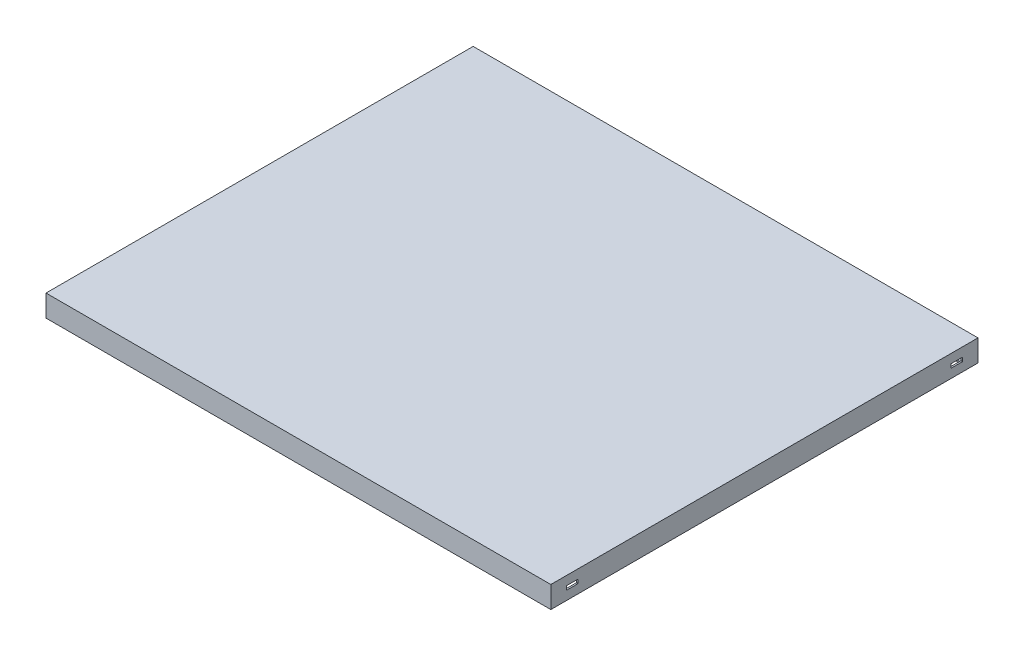
ISO-10303-21;
HEADER;
FILE_DESCRIPTION(('STEP AP214'),'2;1');
FILE_NAME('part.step','',(''),(''),'','','');
FILE_SCHEMA(('AUTOMOTIVE_DESIGN { 1 0 10303 214 1 1 1 1 }'));
ENDSEC;
DATA;
#1=APPLICATION_CONTEXT('core data for automotive mechanical design processes');
#2=APPLICATION_PROTOCOL_DEFINITION('international standard','automotive_design',2000,#1);
#3=PRODUCT_CONTEXT('',#1,'mechanical');
#4=PRODUCT('Part','Part','',(#3));
#5=PRODUCT_RELATED_PRODUCT_CATEGORY('part','',(#4));
#6=PRODUCT_DEFINITION_FORMATION('','',#4);
#7=PRODUCT_DEFINITION_CONTEXT('part definition',#1,'design');
#8=PRODUCT_DEFINITION('design','',#6,#7);
#9=PRODUCT_DEFINITION_SHAPE('','',#8);
#10=(LENGTH_UNIT() NAMED_UNIT(*) SI_UNIT(.MILLI.,.METRE.));
#11=(NAMED_UNIT(*) PLANE_ANGLE_UNIT() SI_UNIT($,.RADIAN.));
#12=(NAMED_UNIT(*) SI_UNIT($,.STERADIAN.) SOLID_ANGLE_UNIT());
#13=UNCERTAINTY_MEASURE_WITH_UNIT(LENGTH_MEASURE(1.E-05),#10,'distance_accuracy_value','');
#14=(GEOMETRIC_REPRESENTATION_CONTEXT(3) GLOBAL_UNCERTAINTY_ASSIGNED_CONTEXT((#13)) GLOBAL_UNIT_ASSIGNED_CONTEXT((#10,
#11,#12)) REPRESENTATION_CONTEXT('',''));
#15=CARTESIAN_POINT('',(0.,0.,0.));
#16=DIRECTION('',(0.,0.,1.));
#17=DIRECTION('',(1.,0.,0.));
#18=AXIS2_PLACEMENT_3D('',#15,#16,#17);
#19=CARTESIAN_POINT('',(323.,28.,275.));
#20=DIRECTION('',(-1.,0.,0.));
#21=DIRECTION('',(0.,0.,1.));
#22=AXIS2_PLACEMENT_3D('',#19,#20,#21);
#23=PLANE('',#22);
#24=DIRECTION('',(0.,-1.,0.));
#25=VECTOR('',#24,1.);
#26=CARTESIAN_POINT('',(323.,28.,240.));
#27=LINE('',#26,#25);
#28=CARTESIAN_POINT('',(323.,16.5,240.));
#29=VERTEX_POINT('',#28);
#30=CARTESIAN_POINT('',(323.,11.5,240.));
#31=VERTEX_POINT('',#30);
#32=EDGE_CURVE('E272',#29,#31,#27,.T.);
#33=ORIENTED_EDGE('',*,*,#32,.F.);
#34=DIRECTION('',(0.,0.,-1.));
#35=VECTOR('',#34,1.);
#36=CARTESIAN_POINT('',(323.,16.5,275.));
#37=LINE('',#36,#35);
#38=CARTESIAN_POINT('',(323.,16.5,255.));
#39=VERTEX_POINT('',#38);
#40=EDGE_CURVE('E268',#39,#29,#37,.T.);
#41=ORIENTED_EDGE('',*,*,#40,.F.);
#42=DIRECTION('',(0.,1.,0.));
#43=VECTOR('',#42,1.);
#44=CARTESIAN_POINT('',(323.,28.,255.));
#45=LINE('',#44,#43);
#46=CARTESIAN_POINT('',(323.,11.5,255.));
#47=VERTEX_POINT('',#46);
#48=EDGE_CURVE('E264',#47,#39,#45,.T.);
#49=ORIENTED_EDGE('',*,*,#48,.F.);
#50=DIRECTION('',(0.,0.,1.));
#51=VECTOR('',#50,1.);
#52=CARTESIAN_POINT('',(323.,11.5,275.));
#53=LINE('',#52,#51);
#54=EDGE_CURVE('E261',#31,#47,#53,.T.);
#55=ORIENTED_EDGE('',*,*,#54,.F.);
#56=EDGE_LOOP('',(#33,#41,#49,#55));
#57=FACE_BOUND('',#56,.T.);
#58=DIRECTION('',(0.,-1.,0.));
#59=VECTOR('',#58,1.);
#60=CARTESIAN_POINT('',(323.,28.,-255.));
#61=LINE('',#60,#59);
#62=CARTESIAN_POINT('',(323.,16.5,-255.));
#63=VERTEX_POINT('',#62);
#64=CARTESIAN_POINT('',(323.,11.5,-255.));
#65=VERTEX_POINT('',#64);
#66=EDGE_CURVE('E324',#63,#65,#61,.T.);
#67=ORIENTED_EDGE('',*,*,#66,.F.);
#68=DIRECTION('',(0.,0.,-1.));
#69=VECTOR('',#68,1.);
#70=CARTESIAN_POINT('',(323.,16.5,275.));
#71=LINE('',#70,#69);
#72=CARTESIAN_POINT('',(323.,16.5,-240.));
#73=VERTEX_POINT('',#72);
#74=EDGE_CURVE('E320',#73,#63,#71,.T.);
#75=ORIENTED_EDGE('',*,*,#74,.F.);
#76=DIRECTION('',(0.,1.,0.));
#77=VECTOR('',#76,1.);
#78=CARTESIAN_POINT('',(323.,28.,-240.));
#79=LINE('',#78,#77);
#80=CARTESIAN_POINT('',(323.,11.5,-240.));
#81=VERTEX_POINT('',#80);
#82=EDGE_CURVE('E316',#81,#73,#79,.T.);
#83=ORIENTED_EDGE('',*,*,#82,.F.);
#84=DIRECTION('',(0.,0.,1.));
#85=VECTOR('',#84,1.);
#86=CARTESIAN_POINT('',(323.,11.5,275.));
#87=LINE('',#86,#85);
#88=EDGE_CURVE('E311',#65,#81,#87,.T.);
#89=ORIENTED_EDGE('',*,*,#88,.F.);
#90=EDGE_LOOP('',(#67,#75,#83,#89));
#91=FACE_BOUND('',#90,.T.);
#92=DIRECTION('',(0.,-1.,0.));
#93=VECTOR('',#92,1.);
#94=CARTESIAN_POINT('',(323.,28.,-273.));
#95=LINE('',#94,#93);
#96=CARTESIAN_POINT('',(323.,26.,-273.));
#97=VERTEX_POINT('',#96);
#98=CARTESIAN_POINT('',(323.,2.,-273.));
#99=VERTEX_POINT('',#98);
#100=EDGE_CURVE('E361',#97,#99,#95,.T.);
#101=ORIENTED_EDGE('',*,*,#100,.T.);
#102=DIRECTION('',(0.,0.,-1.));
#103=VECTOR('',#102,1.);
#104=CARTESIAN_POINT('',(323.,2.,-263.));
#105=LINE('',#104,#103);
#106=CARTESIAN_POINT('',(323.,2.,-263.));
#107=VERTEX_POINT('',#106);
#108=EDGE_CURVE('E341',#107,#99,#105,.T.);
#109=ORIENTED_EDGE('',*,*,#108,.F.);
#110=DIRECTION('',(0.,1.,0.));
#111=VECTOR('',#110,1.);
#112=CARTESIAN_POINT('',(323.,0.,-263.));
#113=LINE('',#112,#111);
#114=CARTESIAN_POINT('',(323.,0.,-263.));
#115=VERTEX_POINT('',#114);
#116=EDGE_CURVE('E333',#115,#107,#113,.T.);
#117=ORIENTED_EDGE('',*,*,#116,.F.);
#118=DIRECTION('',(0.,0.,-1.));
#119=VECTOR('',#118,1.);
#120=CARTESIAN_POINT('',(323.,0.,0.));
#121=LINE('',#120,#119);
#122=CARTESIAN_POINT('',(323.,0.,263.));
#123=VERTEX_POINT('',#122);
#124=EDGE_CURVE('E360',#123,#115,#121,.T.);
#125=ORIENTED_EDGE('',*,*,#124,.F.);
#126=DIRECTION('',(0.,-1.,0.));
#127=VECTOR('',#126,1.);
#128=CARTESIAN_POINT('',(323.,0.,263.));
#129=LINE('',#128,#127);
#130=CARTESIAN_POINT('',(323.,1.99999999999992,263.));
#131=VERTEX_POINT('',#130);
#132=EDGE_CURVE('E349',#131,#123,#129,.T.);
#133=ORIENTED_EDGE('',*,*,#132,.F.);
#134=DIRECTION('',(0.,0.,1.));
#135=VECTOR('',#134,1.);
#136=CARTESIAN_POINT('',(323.,1.99999999999992,263.));
#137=LINE('',#136,#135);
#138=CARTESIAN_POINT('',(323.,1.99999999999992,273.));
#139=VERTEX_POINT('',#138);
#140=EDGE_CURVE('E354',#131,#139,#137,.T.);
#141=ORIENTED_EDGE('',*,*,#140,.T.);
#142=DIRECTION('',(0.,-1.,0.));
#143=VECTOR('',#142,1.);
#144=CARTESIAN_POINT('',(323.,28.,273.));
#145=LINE('',#144,#143);
#146=CARTESIAN_POINT('',(323.,26.,273.));
#147=VERTEX_POINT('',#146);
#148=EDGE_CURVE('E371',#147,#139,#145,.T.);
#149=ORIENTED_EDGE('',*,*,#148,.F.);
#150=DIRECTION('',(0.,0.,-1.));
#151=VECTOR('',#150,1.);
#152=CARTESIAN_POINT('',(323.,26.,0.));
#153=LINE('',#152,#151);
#154=EDGE_CURVE('E366',#147,#97,#153,.T.);
#155=ORIENTED_EDGE('',*,*,#154,.T.);
#156=EDGE_LOOP('',(#101,#109,#117,#125,#133,#141,#149,#155));
#157=FACE_BOUND('',#156,.T.);
#158=ADVANCED_FACE('F33',(#57,#91,#157),#23,.T.);
#159=CARTESIAN_POINT('',(-323.,28.,275.));
#160=DIRECTION('',(1.,0.,0.));
#161=DIRECTION('',(0.,0.,-1.));
#162=AXIS2_PLACEMENT_3D('',#159,#160,#161);
#163=PLANE('',#162);
#164=DIRECTION('',(0.,1.,0.));
#165=VECTOR('',#164,1.);
#166=CARTESIAN_POINT('',(-323.,28.,240.));
#167=LINE('',#166,#165);
#168=CARTESIAN_POINT('',(-323.,11.5,240.));
#169=VERTEX_POINT('',#168);
#170=CARTESIAN_POINT('',(-323.,16.5,240.));
#171=VERTEX_POINT('',#170);
#172=EDGE_CURVE('E270',#169,#171,#167,.T.);
#173=ORIENTED_EDGE('',*,*,#172,.F.);
#174=DIRECTION('',(0.,0.,-1.));
#175=VECTOR('',#174,1.);
#176=CARTESIAN_POINT('',(-323.,11.5,275.));
#177=LINE('',#176,#175);
#178=CARTESIAN_POINT('',(-323.,11.5,255.));
#179=VERTEX_POINT('',#178);
#180=EDGE_CURVE('E258',#179,#169,#177,.T.);
#181=ORIENTED_EDGE('',*,*,#180,.F.);
#182=DIRECTION('',(0.,-1.,0.));
#183=VECTOR('',#182,1.);
#184=CARTESIAN_POINT('',(-323.,28.,255.));
#185=LINE('',#184,#183);
#186=CARTESIAN_POINT('',(-323.,16.5,255.));
#187=VERTEX_POINT('',#186);
#188=EDGE_CURVE('E223',#187,#179,#185,.T.);
#189=ORIENTED_EDGE('',*,*,#188,.F.);
#190=DIRECTION('',(0.,0.,1.));
#191=VECTOR('',#190,1.);
#192=CARTESIAN_POINT('',(-323.,16.5,275.));
#193=LINE('',#192,#191);
#194=EDGE_CURVE('E266',#171,#187,#193,.T.);
#195=ORIENTED_EDGE('',*,*,#194,.F.);
#196=EDGE_LOOP('',(#173,#181,#189,#195));
#197=FACE_BOUND('',#196,.T.);
#198=DIRECTION('',(0.,1.,0.));
#199=VECTOR('',#198,1.);
#200=CARTESIAN_POINT('',(-323.,28.,-255.));
#201=LINE('',#200,#199);
#202=CARTESIAN_POINT('',(-323.,11.5,-255.));
#203=VERTEX_POINT('',#202);
#204=CARTESIAN_POINT('',(-323.,16.5,-255.));
#205=VERTEX_POINT('',#204);
#206=EDGE_CURVE('E322',#203,#205,#201,.T.);
#207=ORIENTED_EDGE('',*,*,#206,.F.);
#208=DIRECTION('',(0.,0.,-1.));
#209=VECTOR('',#208,1.);
#210=CARTESIAN_POINT('',(-323.,11.5,275.));
#211=LINE('',#210,#209);
#212=CARTESIAN_POINT('',(-323.,11.5,-240.));
#213=VERTEX_POINT('',#212);
#214=EDGE_CURVE('E309',#213,#203,#211,.T.);
#215=ORIENTED_EDGE('',*,*,#214,.F.);
#216=DIRECTION('',(0.,-1.,0.));
#217=VECTOR('',#216,1.);
#218=CARTESIAN_POINT('',(-323.,28.,-240.));
#219=LINE('',#218,#217);
#220=CARTESIAN_POINT('',(-323.,16.5,-240.));
#221=VERTEX_POINT('',#220);
#222=EDGE_CURVE('E313',#221,#213,#219,.T.);
#223=ORIENTED_EDGE('',*,*,#222,.F.);
#224=DIRECTION('',(0.,0.,1.));
#225=VECTOR('',#224,1.);
#226=CARTESIAN_POINT('',(-323.,16.5,275.));
#227=LINE('',#226,#225);
#228=EDGE_CURVE('E318',#205,#221,#227,.T.);
#229=ORIENTED_EDGE('',*,*,#228,.F.);
#230=EDGE_LOOP('',(#207,#215,#223,#229));
#231=FACE_BOUND('',#230,.T.);
#232=DIRECTION('',(0.,-1.,0.));
#233=VECTOR('',#232,1.);
#234=CARTESIAN_POINT('',(-323.,0.,-263.));
#235=LINE('',#234,#233);
#236=CARTESIAN_POINT('',(-323.,2.,-263.));
#237=VERTEX_POINT('',#236);
#238=CARTESIAN_POINT('',(-323.,0.,-263.));
#239=VERTEX_POINT('',#238);
#240=EDGE_CURVE('E328',#237,#239,#235,.T.);
#241=ORIENTED_EDGE('',*,*,#240,.F.);
#242=DIRECTION('',(0.,0.,-1.));
#243=VECTOR('',#242,1.);
#244=CARTESIAN_POINT('',(-323.,2.,-263.));
#245=LINE('',#244,#243);
#246=CARTESIAN_POINT('',(-323.,2.,-273.));
#247=VERTEX_POINT('',#246);
#248=EDGE_CURVE('E337',#237,#247,#245,.T.);
#249=ORIENTED_EDGE('',*,*,#248,.T.);
#250=DIRECTION('',(0.,-1.,0.));
#251=VECTOR('',#250,1.);
#252=CARTESIAN_POINT('',(-323.,28.,-273.));
#253=LINE('',#252,#251);
#254=CARTESIAN_POINT('',(-323.,26.,-273.));
#255=VERTEX_POINT('',#254);
#256=EDGE_CURVE('E365',#255,#247,#253,.T.);
#257=ORIENTED_EDGE('',*,*,#256,.F.);
#258=DIRECTION('',(0.,0.,1.));
#259=VECTOR('',#258,1.);
#260=CARTESIAN_POINT('',(-323.,26.,0.));
#261=LINE('',#260,#259);
#262=CARTESIAN_POINT('',(-323.,26.,273.));
#263=VERTEX_POINT('',#262);
#264=EDGE_CURVE('E379',#255,#263,#261,.T.);
#265=ORIENTED_EDGE('',*,*,#264,.T.);
#266=DIRECTION('',(0.,-1.,0.));
#267=VECTOR('',#266,1.);
#268=CARTESIAN_POINT('',(-323.,28.,273.));
#269=LINE('',#268,#267);
#270=CARTESIAN_POINT('',(-323.,2.,273.));
#271=VERTEX_POINT('',#270);
#272=EDGE_CURVE('E374',#263,#271,#269,.T.);
#273=ORIENTED_EDGE('',*,*,#272,.T.);
#274=DIRECTION('',(0.,0.,1.));
#275=VECTOR('',#274,1.);
#276=CARTESIAN_POINT('',(-323.,2.,263.));
#277=LINE('',#276,#275);
#278=CARTESIAN_POINT('',(-323.,2.,263.));
#279=VERTEX_POINT('',#278);
#280=EDGE_CURVE('E358',#279,#271,#277,.T.);
#281=ORIENTED_EDGE('',*,*,#280,.F.);
#282=DIRECTION('',(0.,1.,0.));
#283=VECTOR('',#282,1.);
#284=CARTESIAN_POINT('',(-323.,0.,263.));
#285=LINE('',#284,#283);
#286=CARTESIAN_POINT('',(-323.,0.,263.));
#287=VERTEX_POINT('',#286);
#288=EDGE_CURVE('E344',#287,#279,#285,.T.);
#289=ORIENTED_EDGE('',*,*,#288,.F.);
#290=DIRECTION('',(0.,0.,1.));
#291=VECTOR('',#290,1.);
#292=CARTESIAN_POINT('',(-323.,0.,0.));
#293=LINE('',#292,#291);
#294=EDGE_CURVE('E370',#239,#287,#293,.T.);
#295=ORIENTED_EDGE('',*,*,#294,.F.);
#296=EDGE_LOOP('',(#241,#249,#257,#265,#273,#281,#289,#295));
#297=FACE_BOUND('',#296,.T.);
#298=ADVANCED_FACE('F440',(#197,#231,#297),#163,.T.);
#299=CARTESIAN_POINT('',(-325.,28.,-273.));
#300=DIRECTION('',(0.,0.,1.));
#301=DIRECTION('',(1.,0.,0.));
#302=AXIS2_PLACEMENT_3D('',#299,#300,#301);
#303=PLANE('',#302);
#304=ORIENTED_EDGE('',*,*,#256,.T.);
#305=DIRECTION('',(-1.,0.,0.));
#306=VECTOR('',#305,1.);
#307=CARTESIAN_POINT('',(-323.,2.,-273.));
#308=LINE('',#307,#306);
#309=EDGE_CURVE('E327',#99,#247,#308,.T.);
#310=ORIENTED_EDGE('',*,*,#309,.F.);
#311=ORIENTED_EDGE('',*,*,#100,.F.);
#312=DIRECTION('',(-1.,0.,0.));
#313=VECTOR('',#312,1.);
#314=CARTESIAN_POINT('',(0.,26.,-273.));
#315=LINE('',#314,#313);
#316=EDGE_CURVE('E369',#97,#255,#315,.T.);
#317=ORIENTED_EDGE('',*,*,#316,.T.);
#318=EDGE_LOOP('',(#304,#310,#311,#317));
#319=FACE_BOUND('',#318,.T.);
#320=ADVANCED_FACE('F447',(#319),#303,.T.);
#321=CARTESIAN_POINT('',(-325.,28.,273.));
#322=DIRECTION('',(0.,0.,-1.));
#323=DIRECTION('',(-1.,0.,0.));
#324=AXIS2_PLACEMENT_3D('',#321,#322,#323);
#325=PLANE('',#324);
#326=ORIENTED_EDGE('',*,*,#148,.T.);
#327=DIRECTION('',(1.,0.,0.));
#328=VECTOR('',#327,1.);
#329=CARTESIAN_POINT('',(-323.,2.,273.));
#330=LINE('',#329,#328);
#331=EDGE_CURVE('E343',#271,#139,#330,.T.);
#332=ORIENTED_EDGE('',*,*,#331,.F.);
#333=ORIENTED_EDGE('',*,*,#272,.F.);
#334=DIRECTION('',(1.,0.,0.));
#335=VECTOR('',#334,1.);
#336=CARTESIAN_POINT('',(0.,26.,273.));
#337=LINE('',#336,#335);
#338=EDGE_CURVE('E375',#263,#147,#337,.T.);
#339=ORIENTED_EDGE('',*,*,#338,.T.);
#340=EDGE_LOOP('',(#326,#332,#333,#339));
#341=FACE_BOUND('',#340,.T.);
#342=ADVANCED_FACE('F457',(#341),#325,.T.);
#343=CARTESIAN_POINT('',(0.,0.,0.));
#344=DIRECTION('',(0.,-1.,0.));
#345=DIRECTION('',(0.,0.,-1.));
#346=AXIS2_PLACEMENT_3D('',#343,#344,#345);
#347=PLANE('',#346);
#348=DIRECTION('',(1.,0.,0.));
#349=VECTOR('',#348,1.);
#350=CARTESIAN_POINT('',(-323.,0.,-263.));
#351=LINE('',#350,#349);
#352=EDGE_CURVE('E331',#239,#115,#351,.T.);
#353=ORIENTED_EDGE('',*,*,#352,.F.);
#354=ORIENTED_EDGE('',*,*,#294,.T.);
#355=DIRECTION('',(-1.,0.,0.));
#356=VECTOR('',#355,1.);
#357=CARTESIAN_POINT('',(-323.,0.,263.));
#358=LINE('',#357,#356);
#359=EDGE_CURVE('E351',#123,#287,#358,.T.);
#360=ORIENTED_EDGE('',*,*,#359,.F.);
#361=ORIENTED_EDGE('',*,*,#124,.T.);
#362=EDGE_LOOP('',(#353,#354,#360,#361));
#363=FACE_BOUND('',#362,.T.);
#364=DIRECTION('',(0.,0.,-1.));
#365=VECTOR('',#364,1.);
#366=CARTESIAN_POINT('',(325.,0.,275.));
#367=LINE('',#366,#365);
#368=CARTESIAN_POINT('',(325.,0.,275.));
#369=VERTEX_POINT('',#368);
#370=CARTESIAN_POINT('',(325.,0.,-275.));
#371=VERTEX_POINT('',#370);
#372=EDGE_CURVE('E364',#369,#371,#367,.T.);
#373=ORIENTED_EDGE('',*,*,#372,.F.);
#374=DIRECTION('',(1.,0.,0.));
#375=VECTOR('',#374,1.);
#376=CARTESIAN_POINT('',(-325.,0.,275.));
#377=LINE('',#376,#375);
#378=CARTESIAN_POINT('',(-325.,0.,275.));
#379=VERTEX_POINT('',#378);
#380=EDGE_CURVE('E391',#379,#369,#377,.T.);
#381=ORIENTED_EDGE('',*,*,#380,.F.);
#382=DIRECTION('',(0.,0.,1.));
#383=VECTOR('',#382,1.);
#384=CARTESIAN_POINT('',(-325.,0.,275.));
#385=LINE('',#384,#383);
#386=CARTESIAN_POINT('',(-325.,0.,-275.));
#387=VERTEX_POINT('',#386);
#388=EDGE_CURVE('E402',#387,#379,#385,.T.);
#389=ORIENTED_EDGE('',*,*,#388,.F.);
#390=DIRECTION('',(-1.,0.,0.));
#391=VECTOR('',#390,1.);
#392=CARTESIAN_POINT('',(-325.,0.,-275.));
#393=LINE('',#392,#391);
#394=EDGE_CURVE('E400',#371,#387,#393,.T.);
#395=ORIENTED_EDGE('',*,*,#394,.F.);
#396=EDGE_LOOP('',(#373,#381,#389,#395));
#397=FACE_BOUND('',#396,.T.);
#398=ADVANCED_FACE('F419',(#363,#397),#347,.T.);
#399=CARTESIAN_POINT('',(325.,28.,275.));
#400=DIRECTION('',(-1.,0.,0.));
#401=DIRECTION('',(0.,0.,1.));
#402=AXIS2_PLACEMENT_3D('',#399,#400,#401);
#403=PLANE('',#402);
#404=DIRECTION('',(0.,0.,1.));
#405=VECTOR('',#404,1.);
#406=CARTESIAN_POINT('',(325.,16.5,240.));
#407=LINE('',#406,#405);
#408=CARTESIAN_POINT('',(325.,16.5,240.));
#409=VERTEX_POINT('',#408);
#410=CARTESIAN_POINT('',(325.,16.5,255.));
#411=VERTEX_POINT('',#410);
#412=EDGE_CURVE('E730',#409,#411,#407,.T.);
#413=ORIENTED_EDGE('',*,*,#412,.F.);
#414=DIRECTION('',(0.,1.,0.));
#415=VECTOR('',#414,1.);
#416=CARTESIAN_POINT('',(325.,11.5,240.));
#417=LINE('',#416,#415);
#418=CARTESIAN_POINT('',(325.,11.5,240.));
#419=VERTEX_POINT('',#418);
#420=EDGE_CURVE('E259',#419,#409,#417,.T.);
#421=ORIENTED_EDGE('',*,*,#420,.F.);
#422=DIRECTION('',(0.,0.,-1.));
#423=VECTOR('',#422,1.);
#424=CARTESIAN_POINT('',(325.,11.5,240.));
#425=LINE('',#424,#423);
#426=CARTESIAN_POINT('',(325.,11.5,255.));
#427=VERTEX_POINT('',#426);
#428=EDGE_CURVE('E256',#427,#419,#425,.T.);
#429=ORIENTED_EDGE('',*,*,#428,.F.);
#430=DIRECTION('',(0.,-1.,0.));
#431=VECTOR('',#430,1.);
#432=CARTESIAN_POINT('',(325.,11.5,255.));
#433=LINE('',#432,#431);
#434=EDGE_CURVE('E248',#411,#427,#433,.T.);
#435=ORIENTED_EDGE('',*,*,#434,.F.);
#436=EDGE_LOOP('',(#413,#421,#429,#435));
#437=FACE_BOUND('',#436,.T.);
#438=DIRECTION('',(0.,0.,1.));
#439=VECTOR('',#438,1.);
#440=CARTESIAN_POINT('',(325.,16.5,-255.));
#441=LINE('',#440,#439);
#442=CARTESIAN_POINT('',(325.,16.5,-255.));
#443=VERTEX_POINT('',#442);
#444=CARTESIAN_POINT('',(325.,16.5,-240.));
#445=VERTEX_POINT('',#444);
#446=EDGE_CURVE('E278',#443,#445,#441,.T.);
#447=ORIENTED_EDGE('',*,*,#446,.F.);
#448=DIRECTION('',(0.,1.,0.));
#449=VECTOR('',#448,1.);
#450=CARTESIAN_POINT('',(325.,11.5,-255.));
#451=LINE('',#450,#449);
#452=CARTESIAN_POINT('',(325.,11.5,-255.));
#453=VERTEX_POINT('',#452);
#454=EDGE_CURVE('E281',#453,#443,#451,.T.);
#455=ORIENTED_EDGE('',*,*,#454,.F.);
#456=DIRECTION('',(0.,0.,-1.));
#457=VECTOR('',#456,1.);
#458=CARTESIAN_POINT('',(325.,11.5,-255.));
#459=LINE('',#458,#457);
#460=CARTESIAN_POINT('',(325.,11.5,-240.));
#461=VERTEX_POINT('',#460);
#462=EDGE_CURVE('E283',#461,#453,#459,.T.);
#463=ORIENTED_EDGE('',*,*,#462,.F.);
#464=DIRECTION('',(0.,-1.,0.));
#465=VECTOR('',#464,1.);
#466=CARTESIAN_POINT('',(325.,11.5,-240.));
#467=LINE('',#466,#465);
#468=EDGE_CURVE('E275',#445,#461,#467,.T.);
#469=ORIENTED_EDGE('',*,*,#468,.F.);
#470=EDGE_LOOP('',(#447,#455,#463,#469));
#471=FACE_BOUND('',#470,.T.);
#472=ORIENTED_EDGE('',*,*,#372,.T.);
#473=DIRECTION('',(0.,-1.,0.));
#474=VECTOR('',#473,1.);
#475=CARTESIAN_POINT('',(325.,28.,-275.));
#476=LINE('',#475,#474);
#477=CARTESIAN_POINT('',(325.,28.,-275.));
#478=VERTEX_POINT('',#477);
#479=EDGE_CURVE('E11',#478,#371,#476,.T.);
#480=ORIENTED_EDGE('',*,*,#479,.F.);
#481=DIRECTION('',(0.,0.,-1.));
#482=VECTOR('',#481,1.);
#483=CARTESIAN_POINT('',(325.,28.,275.));
#484=LINE('',#483,#482);
#485=CARTESIAN_POINT('',(325.,28.,275.));
#486=VERTEX_POINT('',#485);
#487=EDGE_CURVE('E387',#486,#478,#484,.T.);
#488=ORIENTED_EDGE('',*,*,#487,.F.);
#489=DIRECTION('',(0.,-1.,0.));
#490=VECTOR('',#489,1.);
#491=CARTESIAN_POINT('',(325.,28.,275.));
#492=LINE('',#491,#490);
#493=EDGE_CURVE('E397',#486,#369,#492,.T.);
#494=ORIENTED_EDGE('',*,*,#493,.T.);
#495=EDGE_LOOP('',(#472,#480,#488,#494));
#496=FACE_BOUND('',#495,.T.);
#497=ADVANCED_FACE('F35',(#437,#471,#496),#403,.F.);
#498=CARTESIAN_POINT('',(-325.,28.,-275.));
#499=DIRECTION('',(0.,0.,1.));
#500=DIRECTION('',(1.,0.,0.));
#501=AXIS2_PLACEMENT_3D('',#498,#499,#500);
#502=PLANE('',#501);
#503=ORIENTED_EDGE('',*,*,#394,.T.);
#504=DIRECTION('',(0.,-1.,0.));
#505=VECTOR('',#504,1.);
#506=CARTESIAN_POINT('',(-325.,28.,-275.));
#507=LINE('',#506,#505);
#508=CARTESIAN_POINT('',(-325.,28.,-275.));
#509=VERTEX_POINT('',#508);
#510=EDGE_CURVE('E41',#509,#387,#507,.T.);
#511=ORIENTED_EDGE('',*,*,#510,.F.);
#512=DIRECTION('',(-1.,0.,0.));
#513=VECTOR('',#512,1.);
#514=CARTESIAN_POINT('',(-325.,28.,-275.));
#515=LINE('',#514,#513);
#516=EDGE_CURVE('E390',#478,#509,#515,.T.);
#517=ORIENTED_EDGE('',*,*,#516,.F.);
#518=ORIENTED_EDGE('',*,*,#479,.T.);
#519=EDGE_LOOP('',(#503,#511,#517,#518));
#520=FACE_BOUND('',#519,.T.);
#521=ADVANCED_FACE('F429',(#520),#502,.F.);
#522=CARTESIAN_POINT('',(-325.,28.,275.));
#523=DIRECTION('',(1.,0.,0.));
#524=DIRECTION('',(0.,0.,-1.));
#525=AXIS2_PLACEMENT_3D('',#522,#523,#524);
#526=PLANE('',#525);
#527=DIRECTION('',(0.,0.,1.));
#528=VECTOR('',#527,1.);
#529=CARTESIAN_POINT('',(-325.,11.5,240.));
#530=LINE('',#529,#528);
#531=CARTESIAN_POINT('',(-325.,11.5,240.));
#532=VERTEX_POINT('',#531);
#533=CARTESIAN_POINT('',(-325.,11.5,255.));
#534=VERTEX_POINT('',#533);
#535=EDGE_CURVE('E229',#532,#534,#530,.T.);
#536=ORIENTED_EDGE('',*,*,#535,.F.);
#537=DIRECTION('',(0.,-1.,0.));
#538=VECTOR('',#537,1.);
#539=CARTESIAN_POINT('',(-325.,11.5,240.));
#540=LINE('',#539,#538);
#541=CARTESIAN_POINT('',(-325.,16.5,240.));
#542=VERTEX_POINT('',#541);
#543=EDGE_CURVE('E235',#542,#532,#540,.T.);
#544=ORIENTED_EDGE('',*,*,#543,.F.);
#545=DIRECTION('',(0.,0.,-1.));
#546=VECTOR('',#545,1.);
#547=CARTESIAN_POINT('',(-325.,16.5,240.));
#548=LINE('',#547,#546);
#549=CARTESIAN_POINT('',(-325.,16.5,255.));
#550=VERTEX_POINT('',#549);
#551=EDGE_CURVE('E240',#550,#542,#548,.T.);
#552=ORIENTED_EDGE('',*,*,#551,.F.);
#553=DIRECTION('',(0.,1.,0.));
#554=VECTOR('',#553,1.);
#555=CARTESIAN_POINT('',(-325.,11.5,255.));
#556=LINE('',#555,#554);
#557=EDGE_CURVE('E220',#534,#550,#556,.T.);
#558=ORIENTED_EDGE('',*,*,#557,.F.);
#559=EDGE_LOOP('',(#536,#544,#552,#558));
#560=FACE_BOUND('',#559,.T.);
#561=DIRECTION('',(0.,0.,1.));
#562=VECTOR('',#561,1.);
#563=CARTESIAN_POINT('',(-325.,11.5,-255.));
#564=LINE('',#563,#562);
#565=CARTESIAN_POINT('',(-325.,11.5,-255.));
#566=VERTEX_POINT('',#565);
#567=CARTESIAN_POINT('',(-325.,11.5,-240.));
#568=VERTEX_POINT('',#567);
#569=EDGE_CURVE('E285',#566,#568,#564,.T.);
#570=ORIENTED_EDGE('',*,*,#569,.F.);
#571=DIRECTION('',(0.,-1.,0.));
#572=VECTOR('',#571,1.);
#573=CARTESIAN_POINT('',(-325.,11.5,-255.));
#574=LINE('',#573,#572);
#575=CARTESIAN_POINT('',(-325.,16.5,-255.));
#576=VERTEX_POINT('',#575);
#577=EDGE_CURVE('E274',#576,#566,#574,.T.);
#578=ORIENTED_EDGE('',*,*,#577,.F.);
#579=DIRECTION('',(0.,0.,-1.));
#580=VECTOR('',#579,1.);
#581=CARTESIAN_POINT('',(-325.,16.5,-255.));
#582=LINE('',#581,#580);
#583=CARTESIAN_POINT('',(-325.,16.5,-240.));
#584=VERTEX_POINT('',#583);
#585=EDGE_CURVE('E291',#584,#576,#582,.T.);
#586=ORIENTED_EDGE('',*,*,#585,.F.);
#587=DIRECTION('',(0.,1.,0.));
#588=VECTOR('',#587,1.);
#589=CARTESIAN_POINT('',(-325.,11.5,-240.));
#590=LINE('',#589,#588);
#591=EDGE_CURVE('E288',#568,#584,#590,.T.);
#592=ORIENTED_EDGE('',*,*,#591,.F.);
#593=EDGE_LOOP('',(#570,#578,#586,#592));
#594=FACE_BOUND('',#593,.T.);
#595=ORIENTED_EDGE('',*,*,#388,.T.);
#596=DIRECTION('',(0.,-1.,0.));
#597=VECTOR('',#596,1.);
#598=CARTESIAN_POINT('',(-325.,28.,275.));
#599=LINE('',#598,#597);
#600=CARTESIAN_POINT('',(-325.,28.,275.));
#601=VERTEX_POINT('',#600);
#602=EDGE_CURVE('E407',#601,#379,#599,.T.);
#603=ORIENTED_EDGE('',*,*,#602,.F.);
#604=DIRECTION('',(0.,0.,1.));
#605=VECTOR('',#604,1.);
#606=CARTESIAN_POINT('',(-325.,28.,275.));
#607=LINE('',#606,#605);
#608=EDGE_CURVE('E393',#509,#601,#607,.T.);
#609=ORIENTED_EDGE('',*,*,#608,.F.);
#610=ORIENTED_EDGE('',*,*,#510,.T.);
#611=EDGE_LOOP('',(#595,#603,#609,#610));
#612=FACE_BOUND('',#611,.T.);
#613=ADVANCED_FACE('F237',(#560,#594,#612),#526,.F.);
#614=CARTESIAN_POINT('',(-325.,28.,275.));
#615=DIRECTION('',(0.,0.,-1.));
#616=DIRECTION('',(-1.,0.,0.));
#617=AXIS2_PLACEMENT_3D('',#614,#615,#616);
#618=PLANE('',#617);
#619=ORIENTED_EDGE('',*,*,#380,.T.);
#620=ORIENTED_EDGE('',*,*,#493,.F.);
#621=DIRECTION('',(1.,0.,0.));
#622=VECTOR('',#621,1.);
#623=CARTESIAN_POINT('',(-325.,28.,275.));
#624=LINE('',#623,#622);
#625=EDGE_CURVE('E395',#601,#486,#624,.T.);
#626=ORIENTED_EDGE('',*,*,#625,.F.);
#627=ORIENTED_EDGE('',*,*,#602,.T.);
#628=EDGE_LOOP('',(#619,#620,#626,#627));
#629=FACE_BOUND('',#628,.T.);
#630=ADVANCED_FACE('F422',(#629),#618,.F.);
#631=CARTESIAN_POINT('',(0.,28.,0.));
#632=DIRECTION('',(0.,-1.,0.));
#633=DIRECTION('',(0.,0.,-1.));
#634=AXIS2_PLACEMENT_3D('',#631,#632,#633);
#635=PLANE('',#634);
#636=ORIENTED_EDGE('',*,*,#487,.T.);
#637=ORIENTED_EDGE('',*,*,#516,.T.);
#638=ORIENTED_EDGE('',*,*,#608,.T.);
#639=ORIENTED_EDGE('',*,*,#625,.T.);
#640=EDGE_LOOP('',(#636,#637,#638,#639));
#641=FACE_BOUND('',#640,.T.);
#642=ADVANCED_FACE('F428',(#641),#635,.F.);
#643=CARTESIAN_POINT('',(0.,26.,0.));
#644=DIRECTION('',(0.,-1.,0.));
#645=DIRECTION('',(0.,0.,-1.));
#646=AXIS2_PLACEMENT_3D('',#643,#644,#645);
#647=PLANE('',#646);
#648=ORIENTED_EDGE('',*,*,#154,.F.);
#649=ORIENTED_EDGE('',*,*,#338,.F.);
#650=ORIENTED_EDGE('',*,*,#264,.F.);
#651=ORIENTED_EDGE('',*,*,#316,.F.);
#652=EDGE_LOOP('',(#648,#649,#650,#651));
#653=FACE_BOUND('',#652,.T.);
#654=ADVANCED_FACE('F463',(#653),#647,.T.);
#655=CARTESIAN_POINT('',(-323.,2.,263.));
#656=DIRECTION('',(0.,-1.,0.));
#657=DIRECTION('',(1.,0.,0.));
#658=AXIS2_PLACEMENT_3D('',#655,#656,#657);
#659=PLANE('',#658);
#660=ORIENTED_EDGE('',*,*,#331,.T.);
#661=ORIENTED_EDGE('',*,*,#140,.F.);
#662=DIRECTION('',(1.,0.,0.));
#663=VECTOR('',#662,1.);
#664=CARTESIAN_POINT('',(-323.,2.,263.));
#665=LINE('',#664,#663);
#666=EDGE_CURVE('E347',#279,#131,#665,.T.);
#667=ORIENTED_EDGE('',*,*,#666,.F.);
#668=ORIENTED_EDGE('',*,*,#280,.T.);
#669=EDGE_LOOP('',(#660,#661,#667,#668));
#670=FACE_BOUND('',#669,.T.);
#671=ADVANCED_FACE('F454',(#670),#659,.F.);
#672=CARTESIAN_POINT('',(0.,0.,263.));
#673=DIRECTION('',(0.,0.,-1.));
#674=DIRECTION('',(-1.,0.,0.));
#675=AXIS2_PLACEMENT_3D('',#672,#673,#674);
#676=PLANE('',#675);
#677=ORIENTED_EDGE('',*,*,#288,.T.);
#678=ORIENTED_EDGE('',*,*,#666,.T.);
#679=ORIENTED_EDGE('',*,*,#132,.T.);
#680=ORIENTED_EDGE('',*,*,#359,.T.);
#681=EDGE_LOOP('',(#677,#678,#679,#680));
#682=FACE_BOUND('',#681,.T.);
#683=ADVANCED_FACE('F518',(#682),#676,.T.);
#684=CARTESIAN_POINT('',(-323.,2.,-263.));
#685=DIRECTION('',(0.,-1.,0.));
#686=DIRECTION('',(0.,0.,-1.));
#687=AXIS2_PLACEMENT_3D('',#684,#685,#686);
#688=PLANE('',#687);
#689=ORIENTED_EDGE('',*,*,#309,.T.);
#690=ORIENTED_EDGE('',*,*,#248,.F.);
#691=DIRECTION('',(-1.,0.,0.));
#692=VECTOR('',#691,1.);
#693=CARTESIAN_POINT('',(-323.,2.,-263.));
#694=LINE('',#693,#692);
#695=EDGE_CURVE('E335',#107,#237,#694,.T.);
#696=ORIENTED_EDGE('',*,*,#695,.F.);
#697=ORIENTED_EDGE('',*,*,#108,.T.);
#698=EDGE_LOOP('',(#689,#690,#696,#697));
#699=FACE_BOUND('',#698,.T.);
#700=ADVANCED_FACE('F525',(#699),#688,.F.);
#701=CARTESIAN_POINT('',(0.,0.,-263.));
#702=DIRECTION('',(0.,0.,-1.));
#703=DIRECTION('',(-1.,0.,0.));
#704=AXIS2_PLACEMENT_3D('',#701,#702,#703);
#705=PLANE('',#704);
#706=ORIENTED_EDGE('',*,*,#240,.T.);
#707=ORIENTED_EDGE('',*,*,#352,.T.);
#708=ORIENTED_EDGE('',*,*,#116,.T.);
#709=ORIENTED_EDGE('',*,*,#695,.T.);
#710=EDGE_LOOP('',(#706,#707,#708,#709));
#711=FACE_BOUND('',#710,.T.);
#712=ADVANCED_FACE('F530',(#711),#705,.F.);
#713=CARTESIAN_POINT('',(340.811388300842,11.5,-255.));
#714=DIRECTION('',(0.,-1.,0.));
#715=DIRECTION('',(0.,0.,-1.));
#716=AXIS2_PLACEMENT_3D('',#713,#714,#715);
#717=PLANE('',#716);
#718=ORIENTED_EDGE('',*,*,#214,.T.);
#719=DIRECTION('',(-1.,0.,0.));
#720=VECTOR('',#719,1.);
#721=CARTESIAN_POINT('',(340.811388300842,11.5,-255.));
#722=LINE('',#721,#720);
#723=EDGE_CURVE('E294',#203,#566,#722,.T.);
#724=ORIENTED_EDGE('',*,*,#723,.T.);
#725=ORIENTED_EDGE('',*,*,#569,.T.);
#726=DIRECTION('',(-1.,0.,0.));
#727=VECTOR('',#726,1.);
#728=CARTESIAN_POINT('',(340.811388300842,11.5,-240.));
#729=LINE('',#728,#727);
#730=EDGE_CURVE('E305',#213,#568,#729,.T.);
#731=ORIENTED_EDGE('',*,*,#730,.F.);
#732=EDGE_LOOP('',(#718,#724,#725,#731));
#733=FACE_BOUND('',#732,.T.);
#734=ADVANCED_FACE('F537',(#733),#717,.F.);
#735=CARTESIAN_POINT('',(340.811388300842,11.5,-240.));
#736=DIRECTION('',(0.,0.,1.));
#737=DIRECTION('',(1.,0.,0.));
#738=AXIS2_PLACEMENT_3D('',#735,#736,#737);
#739=PLANE('',#738);
#740=ORIENTED_EDGE('',*,*,#222,.T.);
#741=ORIENTED_EDGE('',*,*,#730,.T.);
#742=ORIENTED_EDGE('',*,*,#591,.T.);
#743=DIRECTION('',(-1.,0.,0.));
#744=VECTOR('',#743,1.);
#745=CARTESIAN_POINT('',(340.811388300842,16.5,-240.));
#746=LINE('',#745,#744);
#747=EDGE_CURVE('E301',#221,#584,#746,.T.);
#748=ORIENTED_EDGE('',*,*,#747,.F.);
#749=EDGE_LOOP('',(#740,#741,#742,#748));
#750=FACE_BOUND('',#749,.T.);
#751=ADVANCED_FACE('F545',(#750),#739,.F.);
#752=CARTESIAN_POINT('',(340.811388300842,16.5,-255.));
#753=DIRECTION('',(0.,1.,0.));
#754=DIRECTION('',(0.,0.,1.));
#755=AXIS2_PLACEMENT_3D('',#752,#753,#754);
#756=PLANE('',#755);
#757=ORIENTED_EDGE('',*,*,#228,.T.);
#758=ORIENTED_EDGE('',*,*,#747,.T.);
#759=ORIENTED_EDGE('',*,*,#585,.T.);
#760=DIRECTION('',(-1.,0.,0.));
#761=VECTOR('',#760,1.);
#762=CARTESIAN_POINT('',(340.811388300842,16.5,-255.));
#763=LINE('',#762,#761);
#764=EDGE_CURVE('E297',#205,#576,#763,.T.);
#765=ORIENTED_EDGE('',*,*,#764,.F.);
#766=EDGE_LOOP('',(#757,#758,#759,#765));
#767=FACE_BOUND('',#766,.T.);
#768=ADVANCED_FACE('F554',(#767),#756,.F.);
#769=CARTESIAN_POINT('',(340.811388300842,11.5,-255.));
#770=DIRECTION('',(0.,0.,-1.));
#771=DIRECTION('',(-1.,0.,0.));
#772=AXIS2_PLACEMENT_3D('',#769,#770,#771);
#773=PLANE('',#772);
#774=ORIENTED_EDGE('',*,*,#206,.T.);
#775=ORIENTED_EDGE('',*,*,#764,.T.);
#776=ORIENTED_EDGE('',*,*,#577,.T.);
#777=ORIENTED_EDGE('',*,*,#723,.F.);
#778=EDGE_LOOP('',(#774,#775,#776,#777));
#779=FACE_BOUND('',#778,.T.);
#780=ADVANCED_FACE('F563',(#779),#773,.F.);
#781=ORIENTED_EDGE('',*,*,#66,.T.);
#782=EDGE_CURVE('E306',#453,#65,#722,.T.);
#783=ORIENTED_EDGE('',*,*,#782,.F.);
#784=ORIENTED_EDGE('',*,*,#454,.T.);
#785=EDGE_CURVE('E279',#443,#63,#763,.T.);
#786=ORIENTED_EDGE('',*,*,#785,.T.);
#787=EDGE_LOOP('',(#781,#783,#784,#786));
#788=FACE_BOUND('',#787,.T.);
#789=ADVANCED_FACE('F572',(#788),#773,.F.);
#790=ORIENTED_EDGE('',*,*,#74,.T.);
#791=ORIENTED_EDGE('',*,*,#785,.F.);
#792=ORIENTED_EDGE('',*,*,#446,.T.);
#793=EDGE_CURVE('E298',#445,#73,#746,.T.);
#794=ORIENTED_EDGE('',*,*,#793,.T.);
#795=EDGE_LOOP('',(#790,#791,#792,#794));
#796=FACE_BOUND('',#795,.T.);
#797=ADVANCED_FACE('F566',(#796),#756,.F.);
#798=ORIENTED_EDGE('',*,*,#82,.T.);
#799=ORIENTED_EDGE('',*,*,#793,.F.);
#800=ORIENTED_EDGE('',*,*,#468,.T.);
#801=EDGE_CURVE('E302',#461,#81,#729,.T.);
#802=ORIENTED_EDGE('',*,*,#801,.T.);
#803=EDGE_LOOP('',(#798,#799,#800,#802));
#804=FACE_BOUND('',#803,.T.);
#805=ADVANCED_FACE('F557',(#804),#739,.F.);
#806=ORIENTED_EDGE('',*,*,#88,.T.);
#807=ORIENTED_EDGE('',*,*,#801,.F.);
#808=ORIENTED_EDGE('',*,*,#462,.T.);
#809=ORIENTED_EDGE('',*,*,#782,.T.);
#810=EDGE_LOOP('',(#806,#807,#808,#809));
#811=FACE_BOUND('',#810,.T.);
#812=ADVANCED_FACE('F548',(#811),#717,.F.);
#813=CARTESIAN_POINT('',(340.811388300842,11.5,240.));
#814=DIRECTION('',(0.,-1.,0.));
#815=DIRECTION('',(0.,0.,-1.));
#816=AXIS2_PLACEMENT_3D('',#813,#814,#815);
#817=PLANE('',#816);
#818=ORIENTED_EDGE('',*,*,#180,.T.);
#819=DIRECTION('',(-1.,0.,0.));
#820=VECTOR('',#819,1.);
#821=CARTESIAN_POINT('',(340.811388300842,11.5,240.));
#822=LINE('',#821,#820);
#823=EDGE_CURVE('E232',#169,#532,#822,.T.);
#824=ORIENTED_EDGE('',*,*,#823,.T.);
#825=ORIENTED_EDGE('',*,*,#535,.T.);
#826=DIRECTION('',(-1.,0.,0.));
#827=VECTOR('',#826,1.);
#828=CARTESIAN_POINT('',(340.811388300842,11.5,255.));
#829=LINE('',#828,#827);
#830=EDGE_CURVE('E56',#179,#534,#829,.T.);
#831=ORIENTED_EDGE('',*,*,#830,.F.);
#832=EDGE_LOOP('',(#818,#824,#825,#831));
#833=FACE_BOUND('',#832,.T.);
#834=ADVANCED_FACE('F230',(#833),#817,.F.);
#835=CARTESIAN_POINT('',(340.811388300842,11.5,255.));
#836=DIRECTION('',(0.,0.,1.));
#837=DIRECTION('',(1.,0.,0.));
#838=AXIS2_PLACEMENT_3D('',#835,#836,#837);
#839=PLANE('',#838);
#840=ORIENTED_EDGE('',*,*,#188,.T.);
#841=ORIENTED_EDGE('',*,*,#830,.T.);
#842=ORIENTED_EDGE('',*,*,#557,.T.);
#843=DIRECTION('',(-1.,0.,0.));
#844=VECTOR('',#843,1.);
#845=CARTESIAN_POINT('',(340.811388300842,16.5,255.));
#846=LINE('',#845,#844);
#847=EDGE_CURVE('E252',#187,#550,#846,.T.);
#848=ORIENTED_EDGE('',*,*,#847,.F.);
#849=EDGE_LOOP('',(#840,#841,#842,#848));
#850=FACE_BOUND('',#849,.T.);
#851=ADVANCED_FACE('F217',(#850),#839,.F.);
#852=CARTESIAN_POINT('',(340.811388300842,16.5,240.));
#853=DIRECTION('',(0.,1.,0.));
#854=DIRECTION('',(0.,0.,1.));
#855=AXIS2_PLACEMENT_3D('',#852,#853,#854);
#856=PLANE('',#855);
#857=ORIENTED_EDGE('',*,*,#194,.T.);
#858=ORIENTED_EDGE('',*,*,#847,.T.);
#859=ORIENTED_EDGE('',*,*,#551,.T.);
#860=DIRECTION('',(-1.,0.,0.));
#861=VECTOR('',#860,1.);
#862=CARTESIAN_POINT('',(340.811388300842,16.5,240.));
#863=LINE('',#862,#861);
#864=EDGE_CURVE('E249',#171,#542,#863,.T.);
#865=ORIENTED_EDGE('',*,*,#864,.F.);
#866=EDGE_LOOP('',(#857,#858,#859,#865));
#867=FACE_BOUND('',#866,.T.);
#868=ADVANCED_FACE('F611',(#867),#856,.F.);
#869=CARTESIAN_POINT('',(340.811388300842,11.5,240.));
#870=DIRECTION('',(0.,0.,-1.));
#871=DIRECTION('',(-1.,0.,0.));
#872=AXIS2_PLACEMENT_3D('',#869,#870,#871);
#873=PLANE('',#872);
#874=ORIENTED_EDGE('',*,*,#172,.T.);
#875=ORIENTED_EDGE('',*,*,#864,.T.);
#876=ORIENTED_EDGE('',*,*,#543,.T.);
#877=ORIENTED_EDGE('',*,*,#823,.F.);
#878=EDGE_LOOP('',(#874,#875,#876,#877));
#879=FACE_BOUND('',#878,.T.);
#880=ADVANCED_FACE('F619',(#879),#873,.F.);
#881=ORIENTED_EDGE('',*,*,#32,.T.);
#882=EDGE_CURVE('E48',#419,#31,#822,.T.);
#883=ORIENTED_EDGE('',*,*,#882,.F.);
#884=ORIENTED_EDGE('',*,*,#420,.T.);
#885=EDGE_CURVE('E245',#409,#29,#863,.T.);
#886=ORIENTED_EDGE('',*,*,#885,.T.);
#887=EDGE_LOOP('',(#881,#883,#884,#886));
#888=FACE_BOUND('',#887,.T.);
#889=ADVANCED_FACE('F628',(#888),#873,.F.);
#890=ORIENTED_EDGE('',*,*,#40,.T.);
#891=ORIENTED_EDGE('',*,*,#885,.F.);
#892=ORIENTED_EDGE('',*,*,#412,.T.);
#893=EDGE_CURVE('E250',#411,#39,#846,.T.);
#894=ORIENTED_EDGE('',*,*,#893,.T.);
#895=EDGE_LOOP('',(#890,#891,#892,#894));
#896=FACE_BOUND('',#895,.T.);
#897=ADVANCED_FACE('F622',(#896),#856,.F.);
#898=ORIENTED_EDGE('',*,*,#48,.T.);
#899=ORIENTED_EDGE('',*,*,#893,.F.);
#900=ORIENTED_EDGE('',*,*,#434,.T.);
#901=EDGE_CURVE('E225',#427,#47,#829,.T.);
#902=ORIENTED_EDGE('',*,*,#901,.T.);
#903=EDGE_LOOP('',(#898,#899,#900,#902));
#904=FACE_BOUND('',#903,.T.);
#905=ADVANCED_FACE('F613',(#904),#839,.F.);
#906=ORIENTED_EDGE('',*,*,#54,.T.);
#907=ORIENTED_EDGE('',*,*,#901,.F.);
#908=ORIENTED_EDGE('',*,*,#428,.T.);
#909=ORIENTED_EDGE('',*,*,#882,.T.);
#910=EDGE_LOOP('',(#906,#907,#908,#909));
#911=FACE_BOUND('',#910,.T.);
#912=ADVANCED_FACE('F605',(#911),#817,.F.);
#913=CLOSED_SHELL('',(#158,#298,#320,#342,#398,#497,#521,#613,#630,#642,#654,#671,#683,#700,
#712,#734,#751,#768,#780,#789,#797,#805,#812,#834,#851,#868,#880,#889,#897,#905,#912));
#914=MANIFOLD_SOLID_BREP('B2',#913);
#915=ADVANCED_BREP_SHAPE_REPRESENTATION('',(#18,#914),#14);
#916=SHAPE_DEFINITION_REPRESENTATION(#9,#915);
ENDSEC;
END-ISO-10303-21;
